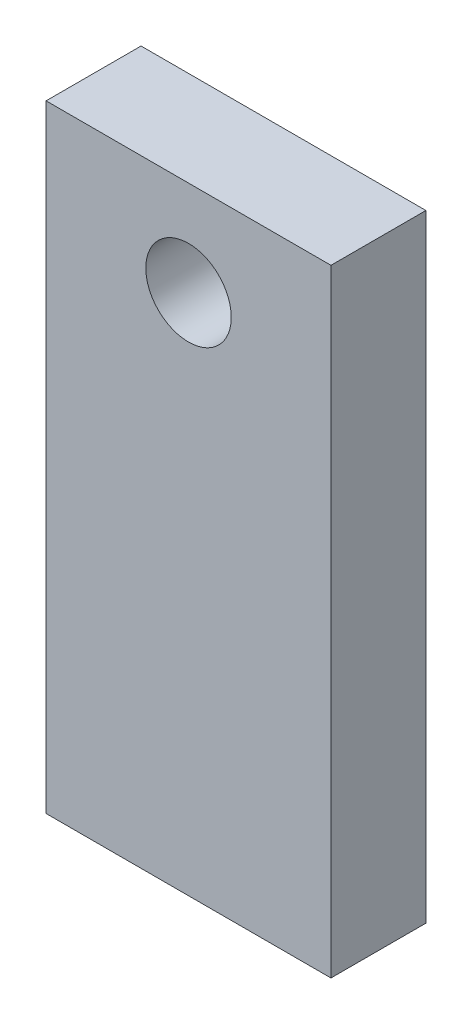
ISO-10303-21;
HEADER;
FILE_DESCRIPTION(('STEP AP214'),'2;1');
FILE_NAME('part.step','',(''),(''),'','','');
FILE_SCHEMA(('AUTOMOTIVE_DESIGN { 1 0 10303 214 1 1 1 1 }'));
ENDSEC;
DATA;
#1=APPLICATION_CONTEXT('core data for automotive mechanical design processes');
#2=APPLICATION_PROTOCOL_DEFINITION('international standard','automotive_design',2000,#1);
#3=PRODUCT_CONTEXT('',#1,'mechanical');
#4=PRODUCT('Part','Part','',(#3));
#5=PRODUCT_RELATED_PRODUCT_CATEGORY('part','',(#4));
#6=PRODUCT_DEFINITION_FORMATION('','',#4);
#7=PRODUCT_DEFINITION_CONTEXT('part definition',#1,'design');
#8=PRODUCT_DEFINITION('design','',#6,#7);
#9=PRODUCT_DEFINITION_SHAPE('','',#8);
#10=(LENGTH_UNIT() NAMED_UNIT(*) SI_UNIT(.MILLI.,.METRE.));
#11=(NAMED_UNIT(*) PLANE_ANGLE_UNIT() SI_UNIT($,.RADIAN.));
#12=(NAMED_UNIT(*) SI_UNIT($,.STERADIAN.) SOLID_ANGLE_UNIT());
#13=UNCERTAINTY_MEASURE_WITH_UNIT(LENGTH_MEASURE(1.E-05),#10,'distance_accuracy_value','');
#14=(GEOMETRIC_REPRESENTATION_CONTEXT(3) GLOBAL_UNCERTAINTY_ASSIGNED_CONTEXT((#13)) GLOBAL_UNIT_ASSIGNED_CONTEXT((#10,
#11,#12)) REPRESENTATION_CONTEXT('',''));
#15=CARTESIAN_POINT('',(0.,0.,0.));
#16=DIRECTION('',(0.,0.,1.));
#17=DIRECTION('',(1.,0.,0.));
#18=AXIS2_PLACEMENT_3D('',#15,#16,#17);
#19=CARTESIAN_POINT('',(7.5,16.25,5.));
#20=DIRECTION('',(-1.,0.,0.));
#21=DIRECTION('',(0.,-1.,0.));
#22=AXIS2_PLACEMENT_3D('',#19,#20,#21);
#23=PLANE('',#22);
#24=DIRECTION('',(0.,1.,0.));
#25=VECTOR('',#24,1.);
#26=CARTESIAN_POINT('',(7.5,16.25,0.));
#27=LINE('',#26,#25);
#28=CARTESIAN_POINT('',(7.5,-16.25,0.));
#29=VERTEX_POINT('',#28);
#30=CARTESIAN_POINT('',(7.5,16.25,0.));
#31=VERTEX_POINT('',#30);
#32=EDGE_CURVE('E98',#29,#31,#27,.T.);
#33=ORIENTED_EDGE('',*,*,#32,.T.);
#34=DIRECTION('',(0.,0.,-1.));
#35=VECTOR('',#34,1.);
#36=CARTESIAN_POINT('',(7.5,16.25,5.));
#37=LINE('',#36,#35);
#38=CARTESIAN_POINT('',(7.5,16.25,5.));
#39=VERTEX_POINT('',#38);
#40=EDGE_CURVE('E11',#39,#31,#37,.T.);
#41=ORIENTED_EDGE('',*,*,#40,.F.);
#42=DIRECTION('',(0.,1.,0.));
#43=VECTOR('',#42,1.);
#44=CARTESIAN_POINT('',(7.5,16.25,5.));
#45=LINE('',#44,#43);
#46=CARTESIAN_POINT('',(7.5,-16.25,5.));
#47=VERTEX_POINT('',#46);
#48=EDGE_CURVE('E99',#47,#39,#45,.T.);
#49=ORIENTED_EDGE('',*,*,#48,.F.);
#50=DIRECTION('',(0.,0.,-1.));
#51=VECTOR('',#50,1.);
#52=CARTESIAN_POINT('',(7.5,-16.25,5.));
#53=LINE('',#52,#51);
#54=EDGE_CURVE('E105',#47,#29,#53,.T.);
#55=ORIENTED_EDGE('',*,*,#54,.T.);
#56=EDGE_LOOP('',(#33,#41,#49,#55));
#57=FACE_BOUND('',#56,.T.);
#58=ADVANCED_FACE('F17',(#57),#23,.F.);
#59=CARTESIAN_POINT('',(-7.5,16.25,5.));
#60=DIRECTION('',(0.,-1.,0.));
#61=DIRECTION('',(0.,0.,-1.));
#62=AXIS2_PLACEMENT_3D('',#59,#60,#61);
#63=PLANE('',#62);
#64=DIRECTION('',(-1.,0.,0.));
#65=VECTOR('',#64,1.);
#66=CARTESIAN_POINT('',(-7.5,16.25,0.));
#67=LINE('',#66,#65);
#68=CARTESIAN_POINT('',(-7.5,16.25,0.));
#69=VERTEX_POINT('',#68);
#70=EDGE_CURVE('E108',#31,#69,#67,.T.);
#71=ORIENTED_EDGE('',*,*,#70,.T.);
#72=DIRECTION('',(0.,0.,-1.));
#73=VECTOR('',#72,1.);
#74=CARTESIAN_POINT('',(-7.5,16.25,5.));
#75=LINE('',#74,#73);
#76=CARTESIAN_POINT('',(-7.5,16.25,5.));
#77=VERTEX_POINT('',#76);
#78=EDGE_CURVE('E25',#77,#69,#75,.T.);
#79=ORIENTED_EDGE('',*,*,#78,.F.);
#80=DIRECTION('',(-1.,0.,0.));
#81=VECTOR('',#80,1.);
#82=CARTESIAN_POINT('',(-7.5,16.25,5.));
#83=LINE('',#82,#81);
#84=EDGE_CURVE('E64',#39,#77,#83,.T.);
#85=ORIENTED_EDGE('',*,*,#84,.F.);
#86=ORIENTED_EDGE('',*,*,#40,.T.);
#87=EDGE_LOOP('',(#71,#79,#85,#86));
#88=FACE_BOUND('',#87,.T.);
#89=ADVANCED_FACE('F135',(#88),#63,.F.);
#90=CARTESIAN_POINT('',(-7.5,16.25,5.));
#91=DIRECTION('',(1.,0.,0.));
#92=DIRECTION('',(0.,1.,0.));
#93=AXIS2_PLACEMENT_3D('',#90,#91,#92);
#94=PLANE('',#93);
#95=DIRECTION('',(0.,-1.,0.));
#96=VECTOR('',#95,1.);
#97=CARTESIAN_POINT('',(-7.5,16.25,0.));
#98=LINE('',#97,#96);
#99=CARTESIAN_POINT('',(-7.5,-16.25,0.));
#100=VERTEX_POINT('',#99);
#101=EDGE_CURVE('E51',#69,#100,#98,.T.);
#102=ORIENTED_EDGE('',*,*,#101,.T.);
#103=DIRECTION('',(0.,0.,-1.));
#104=VECTOR('',#103,1.);
#105=CARTESIAN_POINT('',(-7.5,-16.25,5.));
#106=LINE('',#105,#104);
#107=CARTESIAN_POINT('',(-7.5,-16.25,5.));
#108=VERTEX_POINT('',#107);
#109=EDGE_CURVE('E113',#108,#100,#106,.T.);
#110=ORIENTED_EDGE('',*,*,#109,.F.);
#111=DIRECTION('',(0.,-1.,0.));
#112=VECTOR('',#111,1.);
#113=CARTESIAN_POINT('',(-7.5,16.25,5.));
#114=LINE('',#113,#112);
#115=EDGE_CURVE('E102',#77,#108,#114,.T.);
#116=ORIENTED_EDGE('',*,*,#115,.F.);
#117=ORIENTED_EDGE('',*,*,#78,.T.);
#118=EDGE_LOOP('',(#102,#110,#116,#117));
#119=FACE_BOUND('',#118,.T.);
#120=ADVANCED_FACE('F115',(#119),#94,.F.);
#121=CARTESIAN_POINT('',(-7.5,-16.25,5.));
#122=DIRECTION('',(0.,1.,0.));
#123=DIRECTION('',(0.,0.,1.));
#124=AXIS2_PLACEMENT_3D('',#121,#122,#123);
#125=PLANE('',#124);
#126=CARTESIAN_POINT('',(-5.,-16.25,2.5));
#127=DIRECTION('',(0.,-1.,0.));
#128=DIRECTION('',(0.,0.,-1.));
#129=AXIS2_PLACEMENT_3D('',#126,#127,#128);
#130=CIRCLE('',#129,1.25);
#131=CARTESIAN_POINT('',(-5.,-16.25,1.25));
#132=VERTEX_POINT('',#131);
#133=EDGE_CURVE('E82',#132,#132,#130,.T.);
#134=ORIENTED_EDGE('',*,*,#133,.F.);
#135=EDGE_LOOP('',(#134));
#136=FACE_BOUND('',#135,.T.);
#137=CARTESIAN_POINT('',(5.,-16.25,2.5));
#138=DIRECTION('',(0.,-1.,0.));
#139=DIRECTION('',(0.,0.,-1.));
#140=AXIS2_PLACEMENT_3D('',#137,#138,#139);
#141=CIRCLE('',#140,1.25);
#142=CARTESIAN_POINT('',(5.,-16.25,1.25));
#143=VERTEX_POINT('',#142);
#144=EDGE_CURVE('E81',#143,#143,#141,.T.);
#145=ORIENTED_EDGE('',*,*,#144,.F.);
#146=EDGE_LOOP('',(#145));
#147=FACE_BOUND('',#146,.T.);
#148=DIRECTION('',(1.,0.,0.));
#149=VECTOR('',#148,1.);
#150=CARTESIAN_POINT('',(-7.5,-16.25,0.));
#151=LINE('',#150,#149);
#152=EDGE_CURVE('E57',#100,#29,#151,.T.);
#153=ORIENTED_EDGE('',*,*,#152,.T.);
#154=ORIENTED_EDGE('',*,*,#54,.F.);
#155=DIRECTION('',(1.,0.,0.));
#156=VECTOR('',#155,1.);
#157=CARTESIAN_POINT('',(-7.5,-16.25,5.));
#158=LINE('',#157,#156);
#159=EDGE_CURVE('E33',#108,#47,#158,.T.);
#160=ORIENTED_EDGE('',*,*,#159,.F.);
#161=ORIENTED_EDGE('',*,*,#109,.T.);
#162=EDGE_LOOP('',(#153,#154,#160,#161));
#163=FACE_BOUND('',#162,.T.);
#164=ADVANCED_FACE('F122',(#136,#147,#163),#125,.F.);
#165=CARTESIAN_POINT('',(0.,0.,5.));
#166=DIRECTION('',(0.,0.,1.));
#167=DIRECTION('',(1.,0.,0.));
#168=AXIS2_PLACEMENT_3D('',#165,#166,#167);
#169=PLANE('',#168);
#170=CARTESIAN_POINT('',(0.,11.25,5.));
#171=DIRECTION('',(0.,0.,1.));
#172=DIRECTION('',(1.,0.,0.));
#173=AXIS2_PLACEMENT_3D('',#170,#171,#172);
#174=CIRCLE('',#173,2.25);
#175=CARTESIAN_POINT('',(2.25,11.25,5.));
#176=VERTEX_POINT('',#175);
#177=EDGE_CURVE('E92',#176,#176,#174,.T.);
#178=ORIENTED_EDGE('',*,*,#177,.F.);
#179=EDGE_LOOP('',(#178));
#180=FACE_BOUND('',#179,.T.);
#181=ORIENTED_EDGE('',*,*,#48,.T.);
#182=ORIENTED_EDGE('',*,*,#84,.T.);
#183=ORIENTED_EDGE('',*,*,#115,.T.);
#184=ORIENTED_EDGE('',*,*,#159,.T.);
#185=EDGE_LOOP('',(#181,#182,#183,#184));
#186=FACE_BOUND('',#185,.T.);
#187=ADVANCED_FACE('F124',(#180,#186),#169,.T.);
#188=CARTESIAN_POINT('',(0.,0.,0.));
#189=DIRECTION('',(0.,0.,1.));
#190=DIRECTION('',(1.,0.,0.));
#191=AXIS2_PLACEMENT_3D('',#188,#189,#190);
#192=PLANE('',#191);
#193=CARTESIAN_POINT('',(0.,11.25,0.));
#194=DIRECTION('',(0.,0.,1.));
#195=DIRECTION('',(1.,0.,0.));
#196=AXIS2_PLACEMENT_3D('',#193,#194,#195);
#197=CIRCLE('',#196,2.25);
#198=CARTESIAN_POINT('',(2.25,11.25,0.));
#199=VERTEX_POINT('',#198);
#200=EDGE_CURVE('E95',#199,#199,#197,.T.);
#201=ORIENTED_EDGE('',*,*,#200,.T.);
#202=EDGE_LOOP('',(#201));
#203=FACE_BOUND('',#202,.T.);
#204=ORIENTED_EDGE('',*,*,#32,.F.);
#205=ORIENTED_EDGE('',*,*,#152,.F.);
#206=ORIENTED_EDGE('',*,*,#101,.F.);
#207=ORIENTED_EDGE('',*,*,#70,.F.);
#208=EDGE_LOOP('',(#204,#205,#206,#207));
#209=FACE_BOUND('',#208,.T.);
#210=ADVANCED_FACE('F118',(#203,#209),#192,.F.);
#211=CARTESIAN_POINT('',(0.,11.25,5.));
#212=DIRECTION('',(0.,0.,1.));
#213=DIRECTION('',(1.,0.,0.));
#214=AXIS2_PLACEMENT_3D('',#211,#212,#213);
#215=CYLINDRICAL_SURFACE('',#214,2.25);
#216=ORIENTED_EDGE('',*,*,#200,.F.);
#217=EDGE_LOOP('',(#216));
#218=FACE_BOUND('',#217,.T.);
#219=ORIENTED_EDGE('',*,*,#177,.T.);
#220=EDGE_LOOP('',(#219));
#221=FACE_BOUND('',#220,.T.);
#222=ADVANCED_FACE('F258',(#218,#221),#215,.F.);
#223=CARTESIAN_POINT('',(5.,-8.75,2.5));
#224=DIRECTION('',(0.,-1.,0.));
#225=DIRECTION('',(0.,0.,-1.));
#226=AXIS2_PLACEMENT_3D('',#223,#224,#225);
#227=CONICAL_SURFACE('',#226,1.25,1.02974425867665);
#228=CARTESIAN_POINT('',(5.,-7.99892422621555,2.5));
#229=VERTEX_POINT('',#228);
#230=VERTEX_LOOP('',#229);
#231=FACE_BOUND('',#230,.T.);
#232=CARTESIAN_POINT('',(5.,-8.75,2.5));
#233=DIRECTION('',(0.,-1.,0.));
#234=DIRECTION('',(0.,0.,-1.));
#235=AXIS2_PLACEMENT_3D('',#232,#233,#234);
#236=CIRCLE('',#235,1.25);
#237=CARTESIAN_POINT('',(5.,-8.75,1.25));
#238=VERTEX_POINT('',#237);
#239=EDGE_CURVE('E85',#238,#238,#236,.T.);
#240=ORIENTED_EDGE('',*,*,#239,.T.);
#241=EDGE_LOOP('',(#240));
#242=FACE_BOUND('',#241,.T.);
#243=ADVANCED_FACE('F210',(#231,#242),#227,.F.);
#244=CARTESIAN_POINT('',(5.,-16.25,2.5));
#245=DIRECTION('',(0.,-1.,0.));
#246=DIRECTION('',(0.,0.,-1.));
#247=AXIS2_PLACEMENT_3D('',#244,#245,#246);
#248=CYLINDRICAL_SURFACE('',#247,1.25);
#249=ORIENTED_EDGE('',*,*,#239,.F.);
#250=EDGE_LOOP('',(#249));
#251=FACE_BOUND('',#250,.T.);
#252=ORIENTED_EDGE('',*,*,#144,.T.);
#253=EDGE_LOOP('',(#252));
#254=FACE_BOUND('',#253,.T.);
#255=ADVANCED_FACE('F75',(#251,#254),#248,.F.);
#256=CARTESIAN_POINT('',(-5.,-8.75,2.5));
#257=DIRECTION('',(0.,-1.,0.));
#258=DIRECTION('',(0.,0.,-1.));
#259=AXIS2_PLACEMENT_3D('',#256,#257,#258);
#260=CONICAL_SURFACE('',#259,1.25,1.02974425867665);
#261=CARTESIAN_POINT('',(-5.,-7.99892422621555,2.5));
#262=VERTEX_POINT('',#261);
#263=VERTEX_LOOP('',#262);
#264=FACE_BOUND('',#263,.T.);
#265=CARTESIAN_POINT('',(-5.,-8.75,2.5));
#266=DIRECTION('',(0.,-1.,0.));
#267=DIRECTION('',(0.,0.,-1.));
#268=AXIS2_PLACEMENT_3D('',#265,#266,#267);
#269=CIRCLE('',#268,1.25);
#270=CARTESIAN_POINT('',(-5.,-8.75,1.25));
#271=VERTEX_POINT('',#270);
#272=EDGE_CURVE('E79',#271,#271,#269,.T.);
#273=ORIENTED_EDGE('',*,*,#272,.T.);
#274=EDGE_LOOP('',(#273));
#275=FACE_BOUND('',#274,.T.);
#276=ADVANCED_FACE('F71',(#264,#275),#260,.F.);
#277=CARTESIAN_POINT('',(-5.,-16.25,2.5));
#278=DIRECTION('',(0.,-1.,0.));
#279=DIRECTION('',(0.,0.,-1.));
#280=AXIS2_PLACEMENT_3D('',#277,#278,#279);
#281=CYLINDRICAL_SURFACE('',#280,1.25);
#282=ORIENTED_EDGE('',*,*,#272,.F.);
#283=EDGE_LOOP('',(#282));
#284=FACE_BOUND('',#283,.T.);
#285=ORIENTED_EDGE('',*,*,#133,.T.);
#286=EDGE_LOOP('',(#285));
#287=FACE_BOUND('',#286,.T.);
#288=ADVANCED_FACE('F74',(#284,#287),#281,.F.);
#289=CLOSED_SHELL('',(#58,#89,#120,#164,#187,#210,#222,#243,#255,#276,#288));
#290=MANIFOLD_SOLID_BREP('B1',#289);
#291=ADVANCED_BREP_SHAPE_REPRESENTATION('',(#18,#290),#14);
#292=SHAPE_DEFINITION_REPRESENTATION(#9,#291);
ENDSEC;
END-ISO-10303-21;
